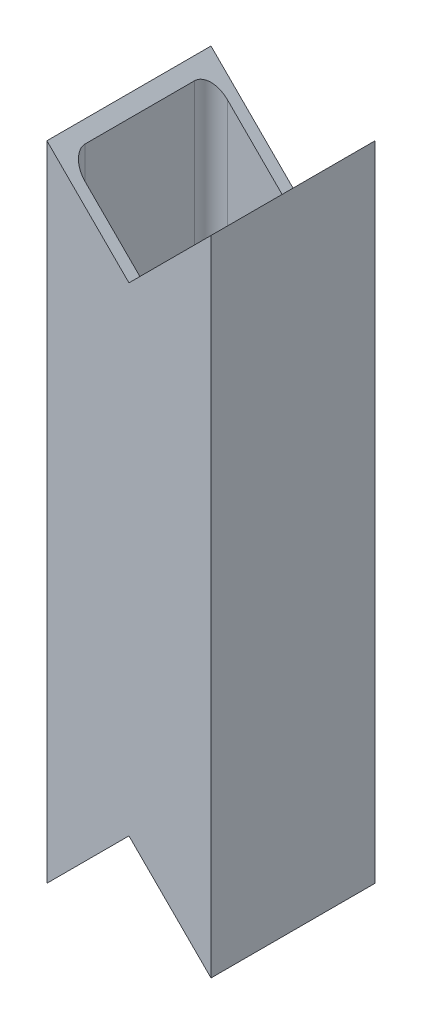
ISO-10303-21;
HEADER;
FILE_DESCRIPTION(('STEP AP214'),'2;1');
FILE_NAME('part.step','',(''),(''),'','','');
FILE_SCHEMA(('AUTOMOTIVE_DESIGN { 1 0 10303 214 1 1 1 1 }'));
ENDSEC;
DATA;
#1=APPLICATION_CONTEXT('core data for automotive mechanical design processes');
#2=APPLICATION_PROTOCOL_DEFINITION('international standard','automotive_design',2000,#1);
#3=PRODUCT_CONTEXT('',#1,'mechanical');
#4=PRODUCT('Part','Part','',(#3));
#5=PRODUCT_RELATED_PRODUCT_CATEGORY('part','',(#4));
#6=PRODUCT_DEFINITION_FORMATION('','',#4);
#7=PRODUCT_DEFINITION_CONTEXT('part definition',#1,'design');
#8=PRODUCT_DEFINITION('design','',#6,#7);
#9=PRODUCT_DEFINITION_SHAPE('','',#8);
#10=(LENGTH_UNIT() NAMED_UNIT(*) SI_UNIT(.MILLI.,.METRE.));
#11=(NAMED_UNIT(*) PLANE_ANGLE_UNIT() SI_UNIT($,.RADIAN.));
#12=(NAMED_UNIT(*) SI_UNIT($,.STERADIAN.) SOLID_ANGLE_UNIT());
#13=UNCERTAINTY_MEASURE_WITH_UNIT(LENGTH_MEASURE(1.E-05),#10,'distance_accuracy_value','');
#14=(GEOMETRIC_REPRESENTATION_CONTEXT(3) GLOBAL_UNCERTAINTY_ASSIGNED_CONTEXT((#13)) GLOBAL_UNIT_ASSIGNED_CONTEXT((#10,
#11,#12)) REPRESENTATION_CONTEXT('',''));
#15=CARTESIAN_POINT('',(0.,0.,0.));
#16=DIRECTION('',(0.,0.,1.));
#17=DIRECTION('',(1.,0.,0.));
#18=AXIS2_PLACEMENT_3D('',#15,#16,#17);
#19=CARTESIAN_POINT('',(0.,0.,30.));
#20=DIRECTION('',(-0.707106781186547,0.707106781186547,0.));
#21=DIRECTION('',(-0.707106781186548,-0.707106781186548,0.));
#22=AXIS2_PLACEMENT_3D('',#19,#20,#21);
#23=PLANE('',#22);
#24=DIRECTION('',(-0.707106781186548,-0.707106781186548,0.));
#25=VECTOR('',#24,1.);
#26=CARTESIAN_POINT('',(0.,0.,28.));
#27=LINE('',#26,#25);
#28=CARTESIAN_POINT('',(15.,15.,28.));
#29=VERTEX_POINT('',#28);
#30=CARTESIAN_POINT('',(5.00000000000003,5.00000000000005,28.));
#31=VERTEX_POINT('',#30);
#32=EDGE_CURVE('E216',#29,#31,#27,.T.);
#33=ORIENTED_EDGE('',*,*,#32,.F.);
#34=DIRECTION('',(0.,0.,-1.));
#35=VECTOR('',#34,1.);
#36=CARTESIAN_POINT('',(15.,15.,30.));
#37=LINE('',#36,#35);
#38=CARTESIAN_POINT('',(15.,15.,30.));
#39=VERTEX_POINT('',#38);
#40=EDGE_CURVE('E153',#39,#29,#37,.T.);
#41=ORIENTED_EDGE('',*,*,#40,.F.);
#42=DIRECTION('',(0.707106781186547,0.707106781186547,0.));
#43=VECTOR('',#42,1.);
#44=CARTESIAN_POINT('',(0.,0.,30.));
#45=LINE('',#44,#43);
#46=CARTESIAN_POINT('',(0.,0.,30.));
#47=VERTEX_POINT('',#46);
#48=EDGE_CURVE('E225',#47,#39,#45,.T.);
#49=ORIENTED_EDGE('',*,*,#48,.F.);
#50=DIRECTION('',(0.,0.,-1.));
#51=VECTOR('',#50,1.);
#52=CARTESIAN_POINT('',(0.,0.,30.));
#53=LINE('',#52,#51);
#54=CARTESIAN_POINT('',(0.,0.,0.));
#55=VERTEX_POINT('',#54);
#56=EDGE_CURVE('E239',#47,#55,#53,.T.);
#57=ORIENTED_EDGE('',*,*,#56,.T.);
#58=DIRECTION('',(0.707106781186547,0.707106781186547,0.));
#59=VECTOR('',#58,1.);
#60=CARTESIAN_POINT('',(0.,0.,0.));
#61=LINE('',#60,#59);
#62=CARTESIAN_POINT('',(15.,15.,0.));
#63=VERTEX_POINT('',#62);
#64=EDGE_CURVE('E224',#55,#63,#61,.T.);
#65=ORIENTED_EDGE('',*,*,#64,.T.);
#66=CARTESIAN_POINT('',(15.,15.,2.));
#67=VERTEX_POINT('',#66);
#68=EDGE_CURVE('E264',#67,#63,#37,.T.);
#69=ORIENTED_EDGE('',*,*,#68,.F.);
#70=DIRECTION('',(0.707106781186548,0.707106781186548,0.));
#71=VECTOR('',#70,1.);
#72=CARTESIAN_POINT('',(0.,0.,2.));
#73=LINE('',#72,#71);
#74=CARTESIAN_POINT('',(5.00000000000002,5.00000000000003,2.));
#75=VERTEX_POINT('',#74);
#76=EDGE_CURVE('E47',#75,#67,#73,.T.);
#77=ORIENTED_EDGE('',*,*,#76,.F.);
#78=CARTESIAN_POINT('',(5.,5.,5.));
#79=DIRECTION('',(-0.707106781186547,0.707106781186547,0.));
#80=DIRECTION('',(-0.707106781186548,-0.707106781186548,0.));
#81=AXIS2_PLACEMENT_3D('',#78,#79,#80);
#82=ELLIPSE('',#81,4.24264068711928,3.);
#83=CARTESIAN_POINT('',(2.,2.,5.00000000000002));
#84=VERTEX_POINT('',#83);
#85=EDGE_CURVE('E204',#84,#75,#82,.F.);
#86=ORIENTED_EDGE('',*,*,#85,.F.);
#87=DIRECTION('',(0.,0.,-1.));
#88=VECTOR('',#87,1.);
#89=CARTESIAN_POINT('',(2.,2.,30.));
#90=LINE('',#89,#88);
#91=CARTESIAN_POINT('',(2.,2.,25.));
#92=VERTEX_POINT('',#91);
#93=EDGE_CURVE('E207',#92,#84,#90,.T.);
#94=ORIENTED_EDGE('',*,*,#93,.F.);
#95=CARTESIAN_POINT('',(5.,5.,25.));
#96=DIRECTION('',(-0.707106781186547,0.707106781186547,0.));
#97=DIRECTION('',(-0.707106781186548,-0.707106781186548,0.));
#98=AXIS2_PLACEMENT_3D('',#95,#96,#97);
#99=ELLIPSE('',#98,4.24264068711928,3.);
#100=EDGE_CURVE('E161',#31,#92,#99,.F.);
#101=ORIENTED_EDGE('',*,*,#100,.F.);
#102=EDGE_LOOP('',(#33,#41,#49,#57,#65,#69,#77,#86,#94,#101));
#103=FACE_BOUND('',#102,.T.);
#104=ADVANCED_FACE('F33',(#103),#23,.F.);
#105=CARTESIAN_POINT('',(15.,15.,30.));
#106=DIRECTION('',(0.707106781186547,0.707106781186547,0.));
#107=DIRECTION('',(-0.707106781186548,0.707106781186548,0.));
#108=AXIS2_PLACEMENT_3D('',#105,#106,#107);
#109=PLANE('',#108);
#110=DIRECTION('',(-0.707106781186548,0.707106781186548,0.));
#111=VECTOR('',#110,1.);
#112=CARTESIAN_POINT('',(15.,15.,28.));
#113=LINE('',#112,#111);
#114=CARTESIAN_POINT('',(25.,5.00000000000003,28.));
#115=VERTEX_POINT('',#114);
#116=EDGE_CURVE('E214',#115,#29,#113,.T.);
#117=ORIENTED_EDGE('',*,*,#116,.F.);
#118=CARTESIAN_POINT('',(25.,5.,25.));
#119=DIRECTION('',(0.707106781186547,0.707106781186547,0.));
#120=DIRECTION('',(0.707106781186548,-0.707106781186548,0.));
#121=AXIS2_PLACEMENT_3D('',#118,#119,#120);
#122=ELLIPSE('',#121,4.24264068711928,3.);
#123=CARTESIAN_POINT('',(28.,2.,25.));
#124=VERTEX_POINT('',#123);
#125=EDGE_CURVE('E222',#124,#115,#122,.F.);
#126=ORIENTED_EDGE('',*,*,#125,.F.);
#127=DIRECTION('',(0.,0.,1.));
#128=VECTOR('',#127,1.);
#129=CARTESIAN_POINT('',(28.,2.,30.));
#130=LINE('',#129,#128);
#131=CARTESIAN_POINT('',(28.,2.,5.00000000000002));
#132=VERTEX_POINT('',#131);
#133=EDGE_CURVE('E220',#132,#124,#130,.T.);
#134=ORIENTED_EDGE('',*,*,#133,.F.);
#135=CARTESIAN_POINT('',(25.,5.,5.));
#136=DIRECTION('',(0.707106781186547,0.707106781186547,0.));
#137=DIRECTION('',(0.707106781186548,-0.707106781186548,0.));
#138=AXIS2_PLACEMENT_3D('',#135,#136,#137);
#139=ELLIPSE('',#138,4.24264068711928,3.);
#140=CARTESIAN_POINT('',(25.,5.00000000000007,2.));
#141=VERTEX_POINT('',#140);
#142=EDGE_CURVE('E192',#141,#132,#139,.F.);
#143=ORIENTED_EDGE('',*,*,#142,.F.);
#144=DIRECTION('',(0.707106781186548,-0.707106781186548,0.));
#145=VECTOR('',#144,1.);
#146=CARTESIAN_POINT('',(15.,15.,2.));
#147=LINE('',#146,#145);
#148=EDGE_CURVE('E203',#67,#141,#147,.T.);
#149=ORIENTED_EDGE('',*,*,#148,.F.);
#150=ORIENTED_EDGE('',*,*,#68,.T.);
#151=DIRECTION('',(0.707106781186547,-0.707106781186547,0.));
#152=VECTOR('',#151,1.);
#153=CARTESIAN_POINT('',(15.,15.,0.));
#154=LINE('',#153,#152);
#155=CARTESIAN_POINT('',(30.,0.,0.));
#156=VERTEX_POINT('',#155);
#157=EDGE_CURVE('E242',#63,#156,#154,.T.);
#158=ORIENTED_EDGE('',*,*,#157,.T.);
#159=DIRECTION('',(0.,0.,-1.));
#160=VECTOR('',#159,1.);
#161=CARTESIAN_POINT('',(30.,0.,30.));
#162=LINE('',#161,#160);
#163=CARTESIAN_POINT('',(30.,0.,30.));
#164=VERTEX_POINT('',#163);
#165=EDGE_CURVE('E261',#164,#156,#162,.T.);
#166=ORIENTED_EDGE('',*,*,#165,.F.);
#167=DIRECTION('',(0.707106781186547,-0.707106781186547,0.));
#168=VECTOR('',#167,1.);
#169=CARTESIAN_POINT('',(15.,15.,30.));
#170=LINE('',#169,#168);
#171=EDGE_CURVE('E228',#39,#164,#170,.T.);
#172=ORIENTED_EDGE('',*,*,#171,.F.);
#173=ORIENTED_EDGE('',*,*,#40,.T.);
#174=EDGE_LOOP('',(#117,#126,#134,#143,#149,#150,#158,#166,#172,#173));
#175=FACE_BOUND('',#174,.T.);
#176=ADVANCED_FACE('F280',(#175),#109,.F.);
#177=CARTESIAN_POINT('',(30.,117.569581740415,30.));
#178=DIRECTION('',(0.707106781186548,-0.707106781186547,0.));
#179=DIRECTION('',(0.707106781186547,0.707106781186548,0.));
#180=AXIS2_PLACEMENT_3D('',#177,#178,#179);
#181=PLANE('',#180);
#182=DIRECTION('',(0.707106781186547,0.707106781186548,0.));
#183=VECTOR('',#182,1.);
#184=CARTESIAN_POINT('',(30.,117.569581740415,28.));
#185=LINE('',#184,#183);
#186=CARTESIAN_POINT('',(15.,102.569581740415,28.));
#187=VERTEX_POINT('',#186);
#188=CARTESIAN_POINT('',(25.,112.569581740415,28.));
#189=VERTEX_POINT('',#188);
#190=EDGE_CURVE('E212',#187,#189,#185,.T.);
#191=ORIENTED_EDGE('',*,*,#190,.F.);
#192=DIRECTION('',(0.,0.,-1.));
#193=VECTOR('',#192,1.);
#194=CARTESIAN_POINT('',(15.,102.569581740415,30.));
#195=LINE('',#194,#193);
#196=CARTESIAN_POINT('',(15.,102.569581740415,30.));
#197=VERTEX_POINT('',#196);
#198=EDGE_CURVE('E256',#197,#187,#195,.T.);
#199=ORIENTED_EDGE('',*,*,#198,.F.);
#200=DIRECTION('',(-0.707106781186547,-0.707106781186548,0.));
#201=VECTOR('',#200,1.);
#202=CARTESIAN_POINT('',(30.,117.569581740415,30.));
#203=LINE('',#202,#201);
#204=CARTESIAN_POINT('',(30.,117.569581740415,30.));
#205=VERTEX_POINT('',#204);
#206=EDGE_CURVE('E233',#205,#197,#203,.T.);
#207=ORIENTED_EDGE('',*,*,#206,.F.);
#208=DIRECTION('',(0.,0.,-1.));
#209=VECTOR('',#208,1.);
#210=CARTESIAN_POINT('',(30.,117.569581740415,30.));
#211=LINE('',#210,#209);
#212=CARTESIAN_POINT('',(30.,117.569581740415,0.));
#213=VERTEX_POINT('',#212);
#214=EDGE_CURVE('E258',#205,#213,#211,.T.);
#215=ORIENTED_EDGE('',*,*,#214,.T.);
#216=DIRECTION('',(-0.707106781186547,-0.707106781186548,0.));
#217=VECTOR('',#216,1.);
#218=CARTESIAN_POINT('',(30.,117.569581740415,0.));
#219=LINE('',#218,#217);
#220=CARTESIAN_POINT('',(15.,102.569581740415,0.));
#221=VERTEX_POINT('',#220);
#222=EDGE_CURVE('E246',#213,#221,#219,.T.);
#223=ORIENTED_EDGE('',*,*,#222,.T.);
#224=CARTESIAN_POINT('',(15.,102.569581740415,2.));
#225=VERTEX_POINT('',#224);
#226=EDGE_CURVE('E201',#225,#221,#195,.T.);
#227=ORIENTED_EDGE('',*,*,#226,.F.);
#228=DIRECTION('',(-0.707106781186547,-0.707106781186548,0.));
#229=VECTOR('',#228,1.);
#230=CARTESIAN_POINT('',(30.,117.569581740415,2.));
#231=LINE('',#230,#229);
#232=CARTESIAN_POINT('',(25.,112.569581740415,2.));
#233=VERTEX_POINT('',#232);
#234=EDGE_CURVE('E199',#233,#225,#231,.T.);
#235=ORIENTED_EDGE('',*,*,#234,.F.);
#236=CARTESIAN_POINT('',(25.,112.569581740415,5.));
#237=DIRECTION('',(0.707106781186548,-0.707106781186547,0.));
#238=DIRECTION('',(-0.707106781186547,-0.707106781186548,0.));
#239=AXIS2_PLACEMENT_3D('',#236,#237,#238);
#240=ELLIPSE('',#239,4.24264068711929,3.);
#241=CARTESIAN_POINT('',(28.,115.569581740415,5.00000000000002));
#242=VERTEX_POINT('',#241);
#243=EDGE_CURVE('E169',#242,#233,#240,.F.);
#244=ORIENTED_EDGE('',*,*,#243,.F.);
#245=DIRECTION('',(0.,0.,-1.));
#246=VECTOR('',#245,1.);
#247=CARTESIAN_POINT('',(28.,115.569581740415,30.));
#248=LINE('',#247,#246);
#249=CARTESIAN_POINT('',(28.,115.569581740415,25.));
#250=VERTEX_POINT('',#249);
#251=EDGE_CURVE('E40',#250,#242,#248,.T.);
#252=ORIENTED_EDGE('',*,*,#251,.F.);
#253=CARTESIAN_POINT('',(25.,112.569581740415,25.));
#254=DIRECTION('',(0.707106781186548,-0.707106781186547,0.));
#255=DIRECTION('',(-0.707106781186547,-0.707106781186548,0.));
#256=AXIS2_PLACEMENT_3D('',#253,#254,#255);
#257=ELLIPSE('',#256,4.24264068711929,3.);
#258=EDGE_CURVE('E11',#189,#250,#257,.F.);
#259=ORIENTED_EDGE('',*,*,#258,.F.);
#260=EDGE_LOOP('',(#191,#199,#207,#215,#223,#227,#235,#244,#252,#259));
#261=FACE_BOUND('',#260,.T.);
#262=ADVANCED_FACE('F197',(#261),#181,.F.);
#263=CARTESIAN_POINT('',(15.,102.569581740415,30.));
#264=DIRECTION('',(-0.707106781186547,-0.707106781186548,0.));
#265=DIRECTION('',(0.707106781186548,-0.707106781186547,0.));
#266=AXIS2_PLACEMENT_3D('',#263,#264,#265);
#267=PLANE('',#266);
#268=DIRECTION('',(0.707106781186548,-0.707106781186547,0.));
#269=VECTOR('',#268,1.);
#270=CARTESIAN_POINT('',(15.,102.569581740415,28.));
#271=LINE('',#270,#269);
#272=CARTESIAN_POINT('',(5.00000000000002,112.569581740415,28.));
#273=VERTEX_POINT('',#272);
#274=EDGE_CURVE('E166',#273,#187,#271,.T.);
#275=ORIENTED_EDGE('',*,*,#274,.F.);
#276=CARTESIAN_POINT('',(5.,112.569581740415,25.));
#277=DIRECTION('',(-0.707106781186547,-0.707106781186548,0.));
#278=DIRECTION('',(0.707106781186548,-0.707106781186547,0.));
#279=AXIS2_PLACEMENT_3D('',#276,#277,#278);
#280=ELLIPSE('',#279,4.24264068711928,3.);
#281=CARTESIAN_POINT('',(2.,115.569581740415,25.));
#282=VERTEX_POINT('',#281);
#283=EDGE_CURVE('E158',#282,#273,#280,.F.);
#284=ORIENTED_EDGE('',*,*,#283,.F.);
#285=DIRECTION('',(0.,0.,1.));
#286=VECTOR('',#285,1.);
#287=CARTESIAN_POINT('',(2.,115.569581740415,30.));
#288=LINE('',#287,#286);
#289=CARTESIAN_POINT('',(2.,115.569581740415,5.00000000000002));
#290=VERTEX_POINT('',#289);
#291=EDGE_CURVE('E144',#290,#282,#288,.T.);
#292=ORIENTED_EDGE('',*,*,#291,.F.);
#293=CARTESIAN_POINT('',(5.,112.569581740415,5.));
#294=DIRECTION('',(-0.707106781186547,-0.707106781186548,0.));
#295=DIRECTION('',(0.707106781186548,-0.707106781186547,0.));
#296=AXIS2_PLACEMENT_3D('',#293,#294,#295);
#297=ELLIPSE('',#296,4.24264068711928,3.);
#298=CARTESIAN_POINT('',(5.00000000000002,112.569581740415,2.));
#299=VERTEX_POINT('',#298);
#300=EDGE_CURVE('E152',#299,#290,#297,.F.);
#301=ORIENTED_EDGE('',*,*,#300,.F.);
#302=DIRECTION('',(-0.707106781186548,0.707106781186547,0.));
#303=VECTOR('',#302,1.);
#304=CARTESIAN_POINT('',(15.,102.569581740415,2.));
#305=LINE('',#304,#303);
#306=EDGE_CURVE('E167',#225,#299,#305,.T.);
#307=ORIENTED_EDGE('',*,*,#306,.F.);
#308=ORIENTED_EDGE('',*,*,#226,.T.);
#309=DIRECTION('',(-0.707106781186548,0.707106781186547,0.));
#310=VECTOR('',#309,1.);
#311=CARTESIAN_POINT('',(15.,102.569581740415,0.));
#312=LINE('',#311,#310);
#313=CARTESIAN_POINT('',(0.,117.569581740415,0.));
#314=VERTEX_POINT('',#313);
#315=EDGE_CURVE('E248',#221,#314,#312,.T.);
#316=ORIENTED_EDGE('',*,*,#315,.T.);
#317=DIRECTION('',(0.,0.,-1.));
#318=VECTOR('',#317,1.);
#319=CARTESIAN_POINT('',(0.,117.569581740415,30.));
#320=LINE('',#319,#318);
#321=CARTESIAN_POINT('',(0.,117.569581740415,30.));
#322=VERTEX_POINT('',#321);
#323=EDGE_CURVE('E253',#322,#314,#320,.T.);
#324=ORIENTED_EDGE('',*,*,#323,.F.);
#325=DIRECTION('',(-0.707106781186548,0.707106781186547,0.));
#326=VECTOR('',#325,1.);
#327=CARTESIAN_POINT('',(15.,102.569581740415,30.));
#328=LINE('',#327,#326);
#329=EDGE_CURVE('E235',#197,#322,#328,.T.);
#330=ORIENTED_EDGE('',*,*,#329,.F.);
#331=ORIENTED_EDGE('',*,*,#198,.T.);
#332=EDGE_LOOP('',(#275,#284,#292,#301,#307,#308,#316,#324,#330,#331));
#333=FACE_BOUND('',#332,.T.);
#334=ADVANCED_FACE('F164',(#333),#267,.F.);
#335=CARTESIAN_POINT('',(30.,0.,30.));
#336=DIRECTION('',(-1.,0.,0.));
#337=DIRECTION('',(0.,-1.,0.));
#338=AXIS2_PLACEMENT_3D('',#335,#336,#337);
#339=PLANE('',#338);
#340=DIRECTION('',(0.,1.,0.));
#341=VECTOR('',#340,1.);
#342=CARTESIAN_POINT('',(30.,0.,0.));
#343=LINE('',#342,#341);
#344=EDGE_CURVE('E244',#156,#213,#343,.T.);
#345=ORIENTED_EDGE('',*,*,#344,.T.);
#346=ORIENTED_EDGE('',*,*,#214,.F.);
#347=DIRECTION('',(0.,1.,0.));
#348=VECTOR('',#347,1.);
#349=CARTESIAN_POINT('',(30.,0.,30.));
#350=LINE('',#349,#348);
#351=EDGE_CURVE('E231',#164,#205,#350,.T.);
#352=ORIENTED_EDGE('',*,*,#351,.F.);
#353=ORIENTED_EDGE('',*,*,#165,.T.);
#354=EDGE_LOOP('',(#345,#346,#352,#353));
#355=FACE_BOUND('',#354,.T.);
#356=ADVANCED_FACE('F290',(#355),#339,.F.);
#357=CARTESIAN_POINT('',(0.,0.,30.));
#358=DIRECTION('',(1.,0.,0.));
#359=DIRECTION('',(0.,0.,-1.));
#360=AXIS2_PLACEMENT_3D('',#357,#358,#359);
#361=PLANE('',#360);
#362=DIRECTION('',(0.,-1.,0.));
#363=VECTOR('',#362,1.);
#364=CARTESIAN_POINT('',(0.,0.,0.));
#365=LINE('',#364,#363);
#366=EDGE_CURVE('E229',#314,#55,#365,.T.);
#367=ORIENTED_EDGE('',*,*,#366,.T.);
#368=ORIENTED_EDGE('',*,*,#56,.F.);
#369=DIRECTION('',(0.,-1.,0.));
#370=VECTOR('',#369,1.);
#371=CARTESIAN_POINT('',(0.,0.,30.));
#372=LINE('',#371,#370);
#373=EDGE_CURVE('E237',#322,#47,#372,.T.);
#374=ORIENTED_EDGE('',*,*,#373,.F.);
#375=ORIENTED_EDGE('',*,*,#323,.T.);
#376=EDGE_LOOP('',(#367,#368,#374,#375));
#377=FACE_BOUND('',#376,.T.);
#378=ADVANCED_FACE('F317',(#377),#361,.F.);
#379=CARTESIAN_POINT('',(0.,0.,30.));
#380=DIRECTION('',(0.,0.,-1.));
#381=DIRECTION('',(-1.,0.,0.));
#382=AXIS2_PLACEMENT_3D('',#379,#380,#381);
#383=PLANE('',#382);
#384=ORIENTED_EDGE('',*,*,#48,.T.);
#385=ORIENTED_EDGE('',*,*,#171,.T.);
#386=ORIENTED_EDGE('',*,*,#351,.T.);
#387=ORIENTED_EDGE('',*,*,#206,.T.);
#388=ORIENTED_EDGE('',*,*,#329,.T.);
#389=ORIENTED_EDGE('',*,*,#373,.T.);
#390=EDGE_LOOP('',(#384,#385,#386,#387,#388,#389));
#391=FACE_BOUND('',#390,.T.);
#392=ADVANCED_FACE('F296',(#391),#383,.F.);
#393=CARTESIAN_POINT('',(0.,0.,0.));
#394=DIRECTION('',(0.,0.,-1.));
#395=DIRECTION('',(-1.,0.,0.));
#396=AXIS2_PLACEMENT_3D('',#393,#394,#395);
#397=PLANE('',#396);
#398=ORIENTED_EDGE('',*,*,#64,.F.);
#399=ORIENTED_EDGE('',*,*,#366,.F.);
#400=ORIENTED_EDGE('',*,*,#315,.F.);
#401=ORIENTED_EDGE('',*,*,#222,.F.);
#402=ORIENTED_EDGE('',*,*,#344,.F.);
#403=ORIENTED_EDGE('',*,*,#157,.F.);
#404=EDGE_LOOP('',(#398,#399,#400,#401,#402,#403));
#405=FACE_BOUND('',#404,.T.);
#406=ADVANCED_FACE('F284',(#405),#397,.T.);
#407=CARTESIAN_POINT('',(25.,171.,25.));
#408=DIRECTION('',(0.,-1.,0.));
#409=DIRECTION('',(0.,0.,-1.));
#410=AXIS2_PLACEMENT_3D('',#407,#408,#409);
#411=CYLINDRICAL_SURFACE('',#410,3.);
#412=ORIENTED_EDGE('',*,*,#125,.T.);
#413=DIRECTION('',(0.,-1.,0.));
#414=VECTOR('',#413,1.);
#415=CARTESIAN_POINT('',(25.,171.,28.));
#416=LINE('',#415,#414);
#417=EDGE_CURVE('E305',#189,#115,#416,.T.);
#418=ORIENTED_EDGE('',*,*,#417,.F.);
#419=ORIENTED_EDGE('',*,*,#258,.T.);
#420=DIRECTION('',(0.,-1.,0.));
#421=VECTOR('',#420,1.);
#422=CARTESIAN_POINT('',(28.,171.,25.));
#423=LINE('',#422,#421);
#424=EDGE_CURVE('E183',#250,#124,#423,.T.);
#425=ORIENTED_EDGE('',*,*,#424,.T.);
#426=EDGE_LOOP('',(#412,#418,#419,#425));
#427=FACE_BOUND('',#426,.T.);
#428=ADVANCED_FACE('F312',(#427),#411,.F.);
#429=CARTESIAN_POINT('',(28.,171.,25.));
#430=DIRECTION('',(-1.,0.,0.));
#431=DIRECTION('',(0.,0.,1.));
#432=AXIS2_PLACEMENT_3D('',#429,#430,#431);
#433=PLANE('',#432);
#434=ORIENTED_EDGE('',*,*,#133,.T.);
#435=ORIENTED_EDGE('',*,*,#424,.F.);
#436=ORIENTED_EDGE('',*,*,#251,.T.);
#437=DIRECTION('',(0.,-1.,0.));
#438=VECTOR('',#437,1.);
#439=CARTESIAN_POINT('',(28.,171.,5.00000000000002));
#440=LINE('',#439,#438);
#441=EDGE_CURVE('E180',#242,#132,#440,.T.);
#442=ORIENTED_EDGE('',*,*,#441,.T.);
#443=EDGE_LOOP('',(#434,#435,#436,#442));
#444=FACE_BOUND('',#443,.T.);
#445=ADVANCED_FACE('F179',(#444),#433,.T.);
#446=CARTESIAN_POINT('',(25.,171.,5.));
#447=DIRECTION('',(0.,-1.,0.));
#448=DIRECTION('',(0.,0.,-1.));
#449=AXIS2_PLACEMENT_3D('',#446,#447,#448);
#450=CYLINDRICAL_SURFACE('',#449,3.);
#451=ORIENTED_EDGE('',*,*,#142,.T.);
#452=ORIENTED_EDGE('',*,*,#441,.F.);
#453=ORIENTED_EDGE('',*,*,#243,.T.);
#454=DIRECTION('',(0.,-1.,0.));
#455=VECTOR('',#454,1.);
#456=CARTESIAN_POINT('',(25.,171.,2.));
#457=LINE('',#456,#455);
#458=EDGE_CURVE('E193',#233,#141,#457,.T.);
#459=ORIENTED_EDGE('',*,*,#458,.T.);
#460=EDGE_LOOP('',(#451,#452,#453,#459));
#461=FACE_BOUND('',#460,.T.);
#462=ADVANCED_FACE('F188',(#461),#450,.F.);
#463=CARTESIAN_POINT('',(5.,171.,25.));
#464=DIRECTION('',(0.,-1.,0.));
#465=DIRECTION('',(0.,0.,-1.));
#466=AXIS2_PLACEMENT_3D('',#463,#464,#465);
#467=CYLINDRICAL_SURFACE('',#466,3.);
#468=ORIENTED_EDGE('',*,*,#100,.T.);
#469=DIRECTION('',(0.,-1.,0.));
#470=VECTOR('',#469,1.);
#471=CARTESIAN_POINT('',(2.,171.,25.));
#472=LINE('',#471,#470);
#473=EDGE_CURVE('E147',#282,#92,#472,.T.);
#474=ORIENTED_EDGE('',*,*,#473,.F.);
#475=ORIENTED_EDGE('',*,*,#283,.T.);
#476=DIRECTION('',(0.,-1.,0.));
#477=VECTOR('',#476,1.);
#478=CARTESIAN_POINT('',(5.00000000000002,171.,28.));
#479=LINE('',#478,#477);
#480=EDGE_CURVE('E303',#273,#31,#479,.T.);
#481=ORIENTED_EDGE('',*,*,#480,.T.);
#482=EDGE_LOOP('',(#468,#474,#475,#481));
#483=FACE_BOUND('',#482,.T.);
#484=ADVANCED_FACE('F156',(#483),#467,.F.);
#485=CARTESIAN_POINT('',(5.00000000000002,171.,28.));
#486=DIRECTION('',(0.,0.,-1.));
#487=DIRECTION('',(-1.,0.,0.));
#488=AXIS2_PLACEMENT_3D('',#485,#486,#487);
#489=PLANE('',#488);
#490=ORIENTED_EDGE('',*,*,#32,.T.);
#491=ORIENTED_EDGE('',*,*,#480,.F.);
#492=ORIENTED_EDGE('',*,*,#274,.T.);
#493=ORIENTED_EDGE('',*,*,#190,.T.);
#494=ORIENTED_EDGE('',*,*,#417,.T.);
#495=ORIENTED_EDGE('',*,*,#116,.T.);
#496=EDGE_LOOP('',(#490,#491,#492,#493,#494,#495));
#497=FACE_BOUND('',#496,.T.);
#498=ADVANCED_FACE('F302',(#497),#489,.T.);
#499=CARTESIAN_POINT('',(5.00000000000002,171.,2.));
#500=DIRECTION('',(0.,0.,1.));
#501=DIRECTION('',(1.,0.,0.));
#502=AXIS2_PLACEMENT_3D('',#499,#500,#501);
#503=PLANE('',#502);
#504=ORIENTED_EDGE('',*,*,#76,.T.);
#505=ORIENTED_EDGE('',*,*,#148,.T.);
#506=ORIENTED_EDGE('',*,*,#458,.F.);
#507=ORIENTED_EDGE('',*,*,#234,.T.);
#508=ORIENTED_EDGE('',*,*,#306,.T.);
#509=DIRECTION('',(0.,-1.,0.));
#510=VECTOR('',#509,1.);
#511=CARTESIAN_POINT('',(5.00000000000002,171.,2.));
#512=LINE('',#511,#510);
#513=EDGE_CURVE('E270',#299,#75,#512,.T.);
#514=ORIENTED_EDGE('',*,*,#513,.T.);
#515=EDGE_LOOP('',(#504,#505,#506,#507,#508,#514));
#516=FACE_BOUND('',#515,.T.);
#517=ADVANCED_FACE('F271',(#516),#503,.T.);
#518=CARTESIAN_POINT('',(5.,171.,5.));
#519=DIRECTION('',(0.,-1.,0.));
#520=DIRECTION('',(0.,0.,-1.));
#521=AXIS2_PLACEMENT_3D('',#518,#519,#520);
#522=CYLINDRICAL_SURFACE('',#521,3.);
#523=ORIENTED_EDGE('',*,*,#85,.T.);
#524=ORIENTED_EDGE('',*,*,#513,.F.);
#525=ORIENTED_EDGE('',*,*,#300,.T.);
#526=DIRECTION('',(0.,-1.,0.));
#527=VECTOR('',#526,1.);
#528=CARTESIAN_POINT('',(2.,171.,5.00000000000002));
#529=LINE('',#528,#527);
#530=EDGE_CURVE('E55',#290,#84,#529,.T.);
#531=ORIENTED_EDGE('',*,*,#530,.T.);
#532=EDGE_LOOP('',(#523,#524,#525,#531));
#533=FACE_BOUND('',#532,.T.);
#534=ADVANCED_FACE('F268',(#533),#522,.F.);
#535=CARTESIAN_POINT('',(2.,171.,25.));
#536=DIRECTION('',(1.,0.,0.));
#537=DIRECTION('',(0.,0.,-1.));
#538=AXIS2_PLACEMENT_3D('',#535,#536,#537);
#539=PLANE('',#538);
#540=ORIENTED_EDGE('',*,*,#93,.T.);
#541=ORIENTED_EDGE('',*,*,#530,.F.);
#542=ORIENTED_EDGE('',*,*,#291,.T.);
#543=ORIENTED_EDGE('',*,*,#473,.T.);
#544=EDGE_LOOP('',(#540,#541,#542,#543));
#545=FACE_BOUND('',#544,.T.);
#546=ADVANCED_FACE('F146',(#545),#539,.T.);
#547=CLOSED_SHELL('',(#104,#176,#262,#334,#356,#378,#392,#406,#428,#445,#462,#484,#498,#517,
#534,#546));
#548=MANIFOLD_SOLID_BREP('B2',#547);
#549=ADVANCED_BREP_SHAPE_REPRESENTATION('',(#18,#548),#14);
#550=SHAPE_DEFINITION_REPRESENTATION(#9,#549);
ENDSEC;
END-ISO-10303-21;
